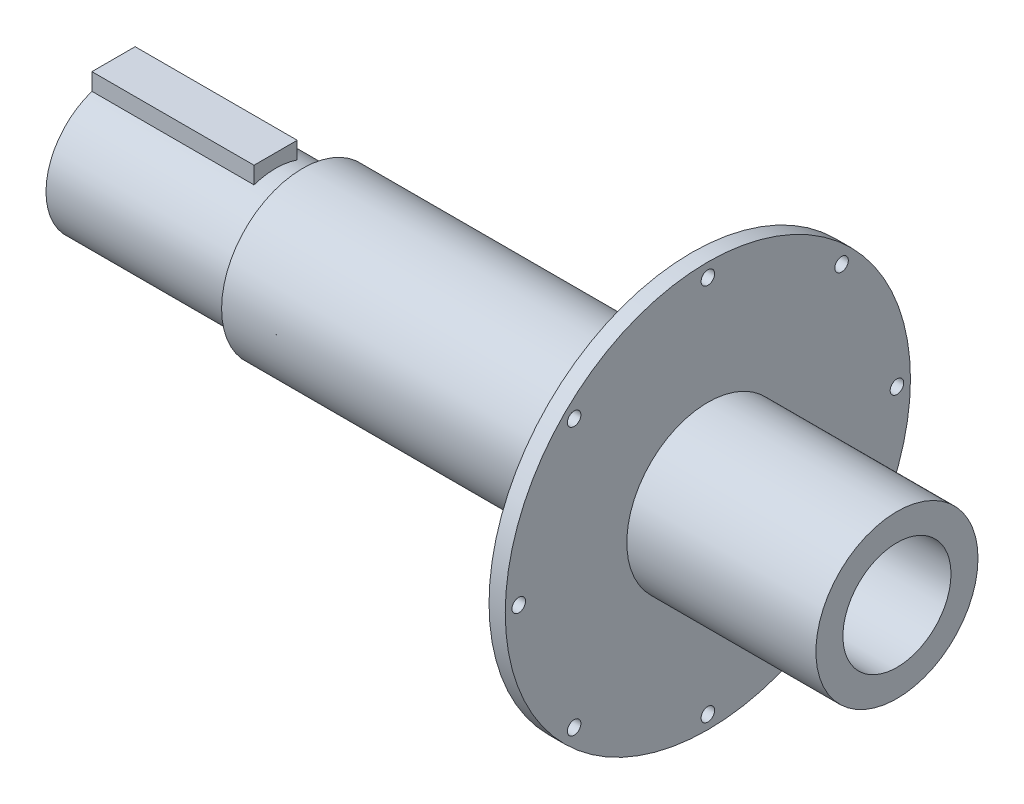
ISO-10303-21;
HEADER;
FILE_DESCRIPTION(('STEP AP214'),'2;1');
FILE_NAME('part.step','',(''),(''),'','','');
FILE_SCHEMA(('AUTOMOTIVE_DESIGN { 1 0 10303 214 1 1 1 1 }'));
ENDSEC;
DATA;
#1=APPLICATION_CONTEXT('core data for automotive mechanical design processes');
#2=APPLICATION_PROTOCOL_DEFINITION('international standard','automotive_design',2000,#1);
#3=PRODUCT_CONTEXT('',#1,'mechanical');
#4=PRODUCT('Part','Part','',(#3));
#5=PRODUCT_RELATED_PRODUCT_CATEGORY('part','',(#4));
#6=PRODUCT_DEFINITION_FORMATION('','',#4);
#7=PRODUCT_DEFINITION_CONTEXT('part definition',#1,'design');
#8=PRODUCT_DEFINITION('design','',#6,#7);
#9=PRODUCT_DEFINITION_SHAPE('','',#8);
#10=(LENGTH_UNIT() NAMED_UNIT(*) SI_UNIT(.MILLI.,.METRE.));
#11=(NAMED_UNIT(*) PLANE_ANGLE_UNIT() SI_UNIT($,.RADIAN.));
#12=(NAMED_UNIT(*) SI_UNIT($,.STERADIAN.) SOLID_ANGLE_UNIT());
#13=UNCERTAINTY_MEASURE_WITH_UNIT(LENGTH_MEASURE(1.E-05),#10,'distance_accuracy_value','');
#14=(GEOMETRIC_REPRESENTATION_CONTEXT(3) GLOBAL_UNCERTAINTY_ASSIGNED_CONTEXT((#13)) GLOBAL_UNIT_ASSIGNED_CONTEXT((#10,
#11,#12)) REPRESENTATION_CONTEXT('',''));
#15=CARTESIAN_POINT('',(0.,0.,0.));
#16=DIRECTION('',(0.,0.,1.));
#17=DIRECTION('',(1.,0.,0.));
#18=AXIS2_PLACEMENT_3D('',#15,#16,#17);
#19=CARTESIAN_POINT('',(-3.,0.,0.));
#20=DIRECTION('',(1.,0.,0.));
#21=DIRECTION('',(0.,0.,-1.));
#22=AXIS2_PLACEMENT_3D('',#19,#20,#21);
#23=CYLINDRICAL_SURFACE('',#22,10.);
#24=CARTESIAN_POINT('',(35.,0.,0.));
#25=DIRECTION('',(1.,0.,0.));
#26=DIRECTION('',(0.,0.,-1.));
#27=AXIS2_PLACEMENT_3D('',#24,#25,#26);
#28=CIRCLE('',#27,10.);
#29=CARTESIAN_POINT('',(35.,0.,-10.));
#30=VERTEX_POINT('',#29);
#31=EDGE_CURVE('E126',#30,#30,#28,.T.);
#32=ORIENTED_EDGE('',*,*,#31,.T.);
#33=EDGE_LOOP('',(#32));
#34=FACE_BOUND('',#33,.T.);
#35=CARTESIAN_POINT('',(-80.,0.,0.));
#36=DIRECTION('',(-1.,0.,0.));
#37=DIRECTION('',(0.,0.,1.));
#38=AXIS2_PLACEMENT_3D('',#35,#36,#37);
#39=CIRCLE('',#38,10.);
#40=CARTESIAN_POINT('',(-80.,0.,10.));
#41=VERTEX_POINT('',#40);
#42=EDGE_CURVE('E11',#41,#41,#39,.F.);
#43=ORIENTED_EDGE('',*,*,#42,.F.);
#44=EDGE_LOOP('',(#43));
#45=FACE_BOUND('',#44,.T.);
#46=ADVANCED_FACE('F45',(#34,#45),#23,.F.);
#47=CARTESIAN_POINT('',(-110.,0.,0.));
#48=DIRECTION('',(1.,0.,0.));
#49=DIRECTION('',(0.,0.,-1.));
#50=AXIS2_PLACEMENT_3D('',#47,#48,#49);
#51=CYLINDRICAL_SURFACE('',#50,15.);
#52=CARTESIAN_POINT('',(-3.,0.,0.));
#53=DIRECTION('',(1.,0.,0.));
#54=DIRECTION('',(0.,0.,-1.));
#55=AXIS2_PLACEMENT_3D('',#52,#53,#54);
#56=CIRCLE('',#55,15.);
#57=CARTESIAN_POINT('',(-3.,0.,-15.));
#58=VERTEX_POINT('',#57);
#59=EDGE_CURVE('E212',#58,#58,#56,.T.);
#60=ORIENTED_EDGE('',*,*,#59,.F.);
#61=EDGE_LOOP('',(#60));
#62=FACE_BOUND('',#61,.T.);
#63=CARTESIAN_POINT('',(-75.,0.,0.));
#64=DIRECTION('',(-1.,0.,0.));
#65=DIRECTION('',(0.,0.,1.));
#66=AXIS2_PLACEMENT_3D('',#63,#64,#65);
#67=CIRCLE('',#66,15.);
#68=CARTESIAN_POINT('',(-75.,0.,15.));
#69=VERTEX_POINT('',#68);
#70=EDGE_CURVE('E162',#69,#69,#67,.F.);
#71=ORIENTED_EDGE('',*,*,#70,.T.);
#72=EDGE_LOOP('',(#71));
#73=FACE_BOUND('',#72,.T.);
#74=ADVANCED_FACE('F238',(#62,#73),#51,.T.);
#75=CARTESIAN_POINT('',(-110.,0.,0.));
#76=DIRECTION('',(1.,0.,0.));
#77=DIRECTION('',(0.,0.,-1.));
#78=AXIS2_PLACEMENT_3D('',#75,#76,#77);
#79=PLANE('',#78);
#80=CARTESIAN_POINT('',(-110.,0.,0.));
#81=DIRECTION('',(-1.,0.,0.));
#82=DIRECTION('',(0.,0.,1.));
#83=AXIS2_PLACEMENT_3D('',#80,#81,#82);
#84=CIRCLE('',#83,12.5);
#85=CARTESIAN_POINT('',(-110.,11.842719282327,-4.));
#86=VERTEX_POINT('',#85);
#87=CARTESIAN_POINT('',(-110.,11.842719282327,4.));
#88=VERTEX_POINT('',#87);
#89=EDGE_CURVE('E171',#86,#88,#84,.T.);
#90=ORIENTED_EDGE('',*,*,#89,.T.);
#91=DIRECTION('',(0.,-1.,0.));
#92=VECTOR('',#91,1.);
#93=CARTESIAN_POINT('',(-110.,0.,4.));
#94=LINE('',#93,#92);
#95=CARTESIAN_POINT('',(-110.,15.,4.));
#96=VERTEX_POINT('',#95);
#97=EDGE_CURVE('E103',#96,#88,#94,.T.);
#98=ORIENTED_EDGE('',*,*,#97,.F.);
#99=DIRECTION('',(0.,0.,1.));
#100=VECTOR('',#99,1.);
#101=CARTESIAN_POINT('',(-110.,15.,0.));
#102=LINE('',#101,#100);
#103=CARTESIAN_POINT('',(-110.,15.,-4.));
#104=VERTEX_POINT('',#103);
#105=EDGE_CURVE('E490',#104,#96,#102,.T.);
#106=ORIENTED_EDGE('',*,*,#105,.F.);
#107=DIRECTION('',(0.,-1.,0.));
#108=VECTOR('',#107,1.);
#109=CARTESIAN_POINT('',(-110.,0.,-4.));
#110=LINE('',#109,#108);
#111=EDGE_CURVE('E60',#104,#86,#110,.T.);
#112=ORIENTED_EDGE('',*,*,#111,.T.);
#113=EDGE_LOOP('',(#90,#98,#106,#112));
#114=FACE_BOUND('',#113,.T.);
#115=ADVANCED_FACE('F245',(#114),#79,.F.);
#116=CARTESIAN_POINT('',(-3.,0.,0.));
#117=DIRECTION('',(1.,0.,0.));
#118=DIRECTION('',(0.,0.,-1.));
#119=AXIS2_PLACEMENT_3D('',#116,#117,#118);
#120=PLANE('',#119);
#121=CARTESIAN_POINT('',(-3.,0.,35.));
#122=DIRECTION('',(-1.,0.,0.));
#123=DIRECTION('',(0.,0.,1.));
#124=AXIS2_PLACEMENT_3D('',#121,#122,#123);
#125=CIRCLE('',#124,1.525);
#126=CARTESIAN_POINT('',(-3.,0.,36.525));
#127=VERTEX_POINT('',#126);
#128=EDGE_CURVE('E164',#127,#127,#125,.T.);
#129=ORIENTED_EDGE('',*,*,#128,.F.);
#130=EDGE_LOOP('',(#129));
#131=FACE_BOUND('',#130,.T.);
#132=CARTESIAN_POINT('',(-3.,35.,0.));
#133=DIRECTION('',(-1.,0.,0.));
#134=DIRECTION('',(0.,0.,1.));
#135=AXIS2_PLACEMENT_3D('',#132,#133,#134);
#136=CIRCLE('',#135,1.525);
#137=CARTESIAN_POINT('',(-3.,35.,1.525));
#138=VERTEX_POINT('',#137);
#139=EDGE_CURVE('E160',#138,#138,#136,.T.);
#140=ORIENTED_EDGE('',*,*,#139,.F.);
#141=EDGE_LOOP('',(#140));
#142=FACE_BOUND('',#141,.T.);
#143=CARTESIAN_POINT('',(-3.,0.,-35.));
#144=DIRECTION('',(-1.,0.,0.));
#145=DIRECTION('',(0.,0.,1.));
#146=AXIS2_PLACEMENT_3D('',#143,#144,#145);
#147=CIRCLE('',#146,1.525);
#148=CARTESIAN_POINT('',(-3.,0.,-33.475));
#149=VERTEX_POINT('',#148);
#150=EDGE_CURVE('E156',#149,#149,#147,.T.);
#151=ORIENTED_EDGE('',*,*,#150,.F.);
#152=EDGE_LOOP('',(#151));
#153=FACE_BOUND('',#152,.T.);
#154=CARTESIAN_POINT('',(-3.,-35.,0.));
#155=DIRECTION('',(-1.,0.,0.));
#156=DIRECTION('',(0.,0.,1.));
#157=AXIS2_PLACEMENT_3D('',#154,#155,#156);
#158=CIRCLE('',#157,1.525);
#159=CARTESIAN_POINT('',(-3.,-35.,1.525));
#160=VERTEX_POINT('',#159);
#161=EDGE_CURVE('E151',#160,#160,#158,.T.);
#162=ORIENTED_EDGE('',*,*,#161,.F.);
#163=EDGE_LOOP('',(#162));
#164=FACE_BOUND('',#163,.T.);
#165=CARTESIAN_POINT('',(-3.,24.7487373415294,24.748737341529));
#166=DIRECTION('',(-1.,0.,0.));
#167=DIRECTION('',(0.,0.,1.));
#168=AXIS2_PLACEMENT_3D('',#165,#166,#167);
#169=CIRCLE('',#168,1.525);
#170=CARTESIAN_POINT('',(-3.,24.7487373415294,26.273737341529));
#171=VERTEX_POINT('',#170);
#172=EDGE_CURVE('E146',#171,#171,#169,.T.);
#173=ORIENTED_EDGE('',*,*,#172,.F.);
#174=EDGE_LOOP('',(#173));
#175=FACE_BOUND('',#174,.T.);
#176=CARTESIAN_POINT('',(-3.,24.7487373415289,-24.7487373415294));
#177=DIRECTION('',(-1.,0.,0.));
#178=DIRECTION('',(0.,0.,1.));
#179=AXIS2_PLACEMENT_3D('',#176,#177,#178);
#180=CIRCLE('',#179,1.525);
#181=CARTESIAN_POINT('',(-3.,24.7487373415289,-23.2237373415294));
#182=VERTEX_POINT('',#181);
#183=EDGE_CURVE('E141',#182,#182,#180,.T.);
#184=ORIENTED_EDGE('',*,*,#183,.F.);
#185=EDGE_LOOP('',(#184));
#186=FACE_BOUND('',#185,.T.);
#187=CARTESIAN_POINT('',(-3.,-24.7487373415294,-24.748737341529));
#188=DIRECTION('',(-1.,0.,0.));
#189=DIRECTION('',(0.,0.,1.));
#190=AXIS2_PLACEMENT_3D('',#187,#188,#189);
#191=CIRCLE('',#190,1.525);
#192=CARTESIAN_POINT('',(-3.,-24.7487373415294,-23.223737341529));
#193=VERTEX_POINT('',#192);
#194=EDGE_CURVE('E136',#193,#193,#191,.T.);
#195=ORIENTED_EDGE('',*,*,#194,.F.);
#196=EDGE_LOOP('',(#195));
#197=FACE_BOUND('',#196,.T.);
#198=CARTESIAN_POINT('',(-3.,-24.748737341529,24.7487373415294));
#199=DIRECTION('',(-1.,0.,0.));
#200=DIRECTION('',(0.,0.,1.));
#201=AXIS2_PLACEMENT_3D('',#198,#199,#200);
#202=CIRCLE('',#201,1.525);
#203=CARTESIAN_POINT('',(-3.,-24.748737341529,26.2737373415294));
#204=VERTEX_POINT('',#203);
#205=EDGE_CURVE('E131',#204,#204,#202,.T.);
#206=ORIENTED_EDGE('',*,*,#205,.F.);
#207=EDGE_LOOP('',(#206));
#208=FACE_BOUND('',#207,.T.);
#209=ORIENTED_EDGE('',*,*,#59,.T.);
#210=EDGE_LOOP('',(#209));
#211=FACE_BOUND('',#210,.T.);
#212=CARTESIAN_POINT('',(-3.,0.,0.));
#213=DIRECTION('',(1.,0.,0.));
#214=DIRECTION('',(0.,0.,-1.));
#215=AXIS2_PLACEMENT_3D('',#212,#213,#214);
#216=CIRCLE('',#215,37.5);
#217=CARTESIAN_POINT('',(-3.,0.,-37.5));
#218=VERTEX_POINT('',#217);
#219=EDGE_CURVE('E114',#218,#218,#216,.T.);
#220=ORIENTED_EDGE('',*,*,#219,.F.);
#221=EDGE_LOOP('',(#220));
#222=FACE_BOUND('',#221,.T.);
#223=ADVANCED_FACE('F233',(#131,#142,#153,#164,#175,#186,#197,#208,#211,#222),#120,.F.);
#224=CARTESIAN_POINT('',(0.,0.,0.));
#225=DIRECTION('',(1.,0.,0.));
#226=DIRECTION('',(0.,0.,-1.));
#227=AXIS2_PLACEMENT_3D('',#224,#225,#226);
#228=PLANE('',#227);
#229=CARTESIAN_POINT('',(0.,0.,35.));
#230=DIRECTION('',(1.,0.,0.));
#231=DIRECTION('',(0.,0.,-1.));
#232=AXIS2_PLACEMENT_3D('',#229,#230,#231);
#233=CIRCLE('',#232,1.25);
#234=CARTESIAN_POINT('',(0.,0.,33.75));
#235=VERTEX_POINT('',#234);
#236=EDGE_CURVE('E158',#235,#235,#233,.T.);
#237=ORIENTED_EDGE('',*,*,#236,.F.);
#238=EDGE_LOOP('',(#237));
#239=FACE_BOUND('',#238,.T.);
#240=CARTESIAN_POINT('',(0.,35.,0.));
#241=DIRECTION('',(1.,0.,0.));
#242=DIRECTION('',(0.,0.,-1.));
#243=AXIS2_PLACEMENT_3D('',#240,#241,#242);
#244=CIRCLE('',#243,1.25);
#245=CARTESIAN_POINT('',(0.,35.,-1.25));
#246=VERTEX_POINT('',#245);
#247=EDGE_CURVE('E153',#246,#246,#244,.T.);
#248=ORIENTED_EDGE('',*,*,#247,.F.);
#249=EDGE_LOOP('',(#248));
#250=FACE_BOUND('',#249,.T.);
#251=CARTESIAN_POINT('',(0.,0.,-35.));
#252=DIRECTION('',(1.,0.,0.));
#253=DIRECTION('',(0.,0.,-1.));
#254=AXIS2_PLACEMENT_3D('',#251,#252,#253);
#255=CIRCLE('',#254,1.25);
#256=CARTESIAN_POINT('',(0.,0.,-36.25));
#257=VERTEX_POINT('',#256);
#258=EDGE_CURVE('E148',#257,#257,#255,.T.);
#259=ORIENTED_EDGE('',*,*,#258,.F.);
#260=EDGE_LOOP('',(#259));
#261=FACE_BOUND('',#260,.T.);
#262=CARTESIAN_POINT('',(0.,-35.,0.));
#263=DIRECTION('',(1.,0.,0.));
#264=DIRECTION('',(0.,0.,-1.));
#265=AXIS2_PLACEMENT_3D('',#262,#263,#264);
#266=CIRCLE('',#265,1.25);
#267=CARTESIAN_POINT('',(0.,-35.,-1.25));
#268=VERTEX_POINT('',#267);
#269=EDGE_CURVE('E143',#268,#268,#266,.T.);
#270=ORIENTED_EDGE('',*,*,#269,.F.);
#271=EDGE_LOOP('',(#270));
#272=FACE_BOUND('',#271,.T.);
#273=CARTESIAN_POINT('',(0.,24.7487373415294,24.748737341529));
#274=DIRECTION('',(1.,0.,0.));
#275=DIRECTION('',(0.,0.,-1.));
#276=AXIS2_PLACEMENT_3D('',#273,#274,#275);
#277=CIRCLE('',#276,1.24999999999999);
#278=CARTESIAN_POINT('',(0.,24.7487373415294,23.498737341529));
#279=VERTEX_POINT('',#278);
#280=EDGE_CURVE('E138',#279,#279,#277,.T.);
#281=ORIENTED_EDGE('',*,*,#280,.F.);
#282=EDGE_LOOP('',(#281));
#283=FACE_BOUND('',#282,.T.);
#284=CARTESIAN_POINT('',(0.,24.7487373415289,-24.7487373415294));
#285=DIRECTION('',(1.,0.,0.));
#286=DIRECTION('',(0.,0.,-1.));
#287=AXIS2_PLACEMENT_3D('',#284,#285,#286);
#288=CIRCLE('',#287,1.24999999999999);
#289=CARTESIAN_POINT('',(0.,24.7487373415289,-25.9987373415294));
#290=VERTEX_POINT('',#289);
#291=EDGE_CURVE('E133',#290,#290,#288,.T.);
#292=ORIENTED_EDGE('',*,*,#291,.F.);
#293=EDGE_LOOP('',(#292));
#294=FACE_BOUND('',#293,.T.);
#295=CARTESIAN_POINT('',(0.,-24.7487373415294,-24.748737341529));
#296=DIRECTION('',(1.,0.,0.));
#297=DIRECTION('',(0.,0.,-1.));
#298=AXIS2_PLACEMENT_3D('',#295,#296,#297);
#299=CIRCLE('',#298,1.24999999999999);
#300=CARTESIAN_POINT('',(0.,-24.7487373415294,-25.998737341529));
#301=VERTEX_POINT('',#300);
#302=EDGE_CURVE('E128',#301,#301,#299,.T.);
#303=ORIENTED_EDGE('',*,*,#302,.F.);
#304=EDGE_LOOP('',(#303));
#305=FACE_BOUND('',#304,.T.);
#306=CARTESIAN_POINT('',(0.,-24.748737341529,24.7487373415294));
#307=DIRECTION('',(1.,0.,0.));
#308=DIRECTION('',(0.,0.,-1.));
#309=AXIS2_PLACEMENT_3D('',#306,#307,#308);
#310=CIRCLE('',#309,1.24999999999999);
#311=CARTESIAN_POINT('',(0.,-24.748737341529,23.4987373415294));
#312=VERTEX_POINT('',#311);
#313=EDGE_CURVE('E123',#312,#312,#310,.T.);
#314=ORIENTED_EDGE('',*,*,#313,.F.);
#315=EDGE_LOOP('',(#314));
#316=FACE_BOUND('',#315,.T.);
#317=CARTESIAN_POINT('',(0.,0.,0.));
#318=DIRECTION('',(1.,0.,0.));
#319=DIRECTION('',(0.,0.,-1.));
#320=AXIS2_PLACEMENT_3D('',#317,#318,#319);
#321=CIRCLE('',#320,15.);
#322=CARTESIAN_POINT('',(0.,0.,-15.));
#323=VERTEX_POINT('',#322);
#324=EDGE_CURVE('E112',#323,#323,#321,.T.);
#325=ORIENTED_EDGE('',*,*,#324,.F.);
#326=EDGE_LOOP('',(#325));
#327=FACE_BOUND('',#326,.T.);
#328=CARTESIAN_POINT('',(0.,0.,0.));
#329=DIRECTION('',(1.,0.,0.));
#330=DIRECTION('',(0.,0.,-1.));
#331=AXIS2_PLACEMENT_3D('',#328,#329,#330);
#332=CIRCLE('',#331,37.5);
#333=CARTESIAN_POINT('',(0.,0.,-37.5));
#334=VERTEX_POINT('',#333);
#335=EDGE_CURVE('E119',#334,#334,#332,.T.);
#336=ORIENTED_EDGE('',*,*,#335,.T.);
#337=EDGE_LOOP('',(#336));
#338=FACE_BOUND('',#337,.T.);
#339=ADVANCED_FACE('F219',(#239,#250,#261,#272,#283,#294,#305,#316,#327,#338),#228,.T.);
#340=CARTESIAN_POINT('',(-3.,0.,0.));
#341=DIRECTION('',(1.,0.,0.));
#342=DIRECTION('',(0.,0.,-1.));
#343=AXIS2_PLACEMENT_3D('',#340,#341,#342);
#344=CYLINDRICAL_SURFACE('',#343,37.5);
#345=ORIENTED_EDGE('',*,*,#219,.T.);
#346=EDGE_LOOP('',(#345));
#347=FACE_BOUND('',#346,.T.);
#348=ORIENTED_EDGE('',*,*,#335,.F.);
#349=EDGE_LOOP('',(#348));
#350=FACE_BOUND('',#349,.T.);
#351=ADVANCED_FACE('F221',(#347,#350),#344,.T.);
#352=CARTESIAN_POINT('',(35.,0.,0.));
#353=DIRECTION('',(1.,0.,0.));
#354=DIRECTION('',(0.,0.,-1.));
#355=AXIS2_PLACEMENT_3D('',#352,#353,#354);
#356=PLANE('',#355);
#357=ORIENTED_EDGE('',*,*,#31,.F.);
#358=EDGE_LOOP('',(#357));
#359=FACE_BOUND('',#358,.T.);
#360=CARTESIAN_POINT('',(35.,0.,0.));
#361=DIRECTION('',(1.,0.,0.));
#362=DIRECTION('',(0.,0.,-1.));
#363=AXIS2_PLACEMENT_3D('',#360,#361,#362);
#364=CIRCLE('',#363,15.);
#365=CARTESIAN_POINT('',(35.,0.,-15.));
#366=VERTEX_POINT('',#365);
#367=EDGE_CURVE('E209',#366,#366,#364,.T.);
#368=ORIENTED_EDGE('',*,*,#367,.T.);
#369=EDGE_LOOP('',(#368));
#370=FACE_BOUND('',#369,.T.);
#371=ADVANCED_FACE('F223',(#359,#370),#356,.T.);
#372=ORIENTED_EDGE('',*,*,#324,.T.);
#373=EDGE_LOOP('',(#372));
#374=FACE_BOUND('',#373,.T.);
#375=ORIENTED_EDGE('',*,*,#367,.F.);
#376=EDGE_LOOP('',(#375));
#377=FACE_BOUND('',#376,.T.);
#378=ADVANCED_FACE('F230',(#374,#377),#51,.T.);
#379=CARTESIAN_POINT('',(-3.,-24.748737341529,24.7487373415294));
#380=DIRECTION('',(-1.,0.,0.));
#381=DIRECTION('',(0.,0.,1.));
#382=AXIS2_PLACEMENT_3D('',#379,#380,#381);
#383=CYLINDRICAL_SURFACE('',#382,1.24999999999999);
#384=ORIENTED_EDGE('',*,*,#313,.T.);
#385=EDGE_LOOP('',(#384));
#386=FACE_BOUND('',#385,.T.);
#387=CARTESIAN_POINT('',(-2.725,-24.748737341529,24.7487373415294));
#388=DIRECTION('',(-1.,0.,0.));
#389=DIRECTION('',(0.,0.,1.));
#390=AXIS2_PLACEMENT_3D('',#387,#388,#389);
#391=CIRCLE('',#390,1.25);
#392=CARTESIAN_POINT('',(-2.725,-24.748737341529,25.9987373415294));
#393=VERTEX_POINT('',#392);
#394=EDGE_CURVE('E127',#393,#393,#391,.T.);
#395=ORIENTED_EDGE('',*,*,#394,.T.);
#396=EDGE_LOOP('',(#395));
#397=FACE_BOUND('',#396,.T.);
#398=ADVANCED_FACE('F334',(#386,#397),#383,.F.);
#399=CARTESIAN_POINT('',(-3.,-24.748737341529,24.7487373415294));
#400=DIRECTION('',(-1.,0.,0.));
#401=DIRECTION('',(0.,0.,1.));
#402=AXIS2_PLACEMENT_3D('',#399,#400,#401);
#403=CONICAL_SURFACE('',#402,1.525,0.785398163397445);
#404=ORIENTED_EDGE('',*,*,#394,.F.);
#405=EDGE_LOOP('',(#404));
#406=FACE_BOUND('',#405,.T.);
#407=ORIENTED_EDGE('',*,*,#205,.T.);
#408=EDGE_LOOP('',(#407));
#409=FACE_BOUND('',#408,.T.);
#410=ADVANCED_FACE('F330',(#406,#409),#403,.F.);
#411=CARTESIAN_POINT('',(-3.,-24.7487373415294,-24.748737341529));
#412=DIRECTION('',(-1.,0.,0.));
#413=DIRECTION('',(0.,0.,1.));
#414=AXIS2_PLACEMENT_3D('',#411,#412,#413);
#415=CYLINDRICAL_SURFACE('',#414,1.24999999999999);
#416=ORIENTED_EDGE('',*,*,#302,.T.);
#417=EDGE_LOOP('',(#416));
#418=FACE_BOUND('',#417,.T.);
#419=CARTESIAN_POINT('',(-2.725,-24.7487373415294,-24.748737341529));
#420=DIRECTION('',(-1.,0.,0.));
#421=DIRECTION('',(0.,0.,1.));
#422=AXIS2_PLACEMENT_3D('',#419,#420,#421);
#423=CIRCLE('',#422,1.25);
#424=CARTESIAN_POINT('',(-2.725,-24.7487373415294,-23.498737341529));
#425=VERTEX_POINT('',#424);
#426=EDGE_CURVE('E132',#425,#425,#423,.T.);
#427=ORIENTED_EDGE('',*,*,#426,.T.);
#428=EDGE_LOOP('',(#427));
#429=FACE_BOUND('',#428,.T.);
#430=ADVANCED_FACE('F326',(#418,#429),#415,.F.);
#431=CARTESIAN_POINT('',(-3.,-24.7487373415294,-24.748737341529));
#432=DIRECTION('',(-1.,0.,0.));
#433=DIRECTION('',(0.,0.,1.));
#434=AXIS2_PLACEMENT_3D('',#431,#432,#433);
#435=CONICAL_SURFACE('',#434,1.525,0.785398163397445);
#436=ORIENTED_EDGE('',*,*,#426,.F.);
#437=EDGE_LOOP('',(#436));
#438=FACE_BOUND('',#437,.T.);
#439=ORIENTED_EDGE('',*,*,#194,.T.);
#440=EDGE_LOOP('',(#439));
#441=FACE_BOUND('',#440,.T.);
#442=ADVANCED_FACE('F322',(#438,#441),#435,.F.);
#443=CARTESIAN_POINT('',(-3.,24.7487373415289,-24.7487373415294));
#444=DIRECTION('',(-1.,0.,0.));
#445=DIRECTION('',(0.,0.,1.));
#446=AXIS2_PLACEMENT_3D('',#443,#444,#445);
#447=CYLINDRICAL_SURFACE('',#446,1.24999999999999);
#448=ORIENTED_EDGE('',*,*,#291,.T.);
#449=EDGE_LOOP('',(#448));
#450=FACE_BOUND('',#449,.T.);
#451=CARTESIAN_POINT('',(-2.725,24.7487373415289,-24.7487373415294));
#452=DIRECTION('',(-1.,0.,0.));
#453=DIRECTION('',(0.,0.,1.));
#454=AXIS2_PLACEMENT_3D('',#451,#452,#453);
#455=CIRCLE('',#454,1.25);
#456=CARTESIAN_POINT('',(-2.725,24.7487373415289,-23.4987373415294));
#457=VERTEX_POINT('',#456);
#458=EDGE_CURVE('E137',#457,#457,#455,.T.);
#459=ORIENTED_EDGE('',*,*,#458,.T.);
#460=EDGE_LOOP('',(#459));
#461=FACE_BOUND('',#460,.T.);
#462=ADVANCED_FACE('F318',(#450,#461),#447,.F.);
#463=CARTESIAN_POINT('',(-3.,24.7487373415289,-24.7487373415294));
#464=DIRECTION('',(-1.,0.,0.));
#465=DIRECTION('',(0.,0.,1.));
#466=AXIS2_PLACEMENT_3D('',#463,#464,#465);
#467=CONICAL_SURFACE('',#466,1.525,0.785398163397445);
#468=ORIENTED_EDGE('',*,*,#458,.F.);
#469=EDGE_LOOP('',(#468));
#470=FACE_BOUND('',#469,.T.);
#471=ORIENTED_EDGE('',*,*,#183,.T.);
#472=EDGE_LOOP('',(#471));
#473=FACE_BOUND('',#472,.T.);
#474=ADVANCED_FACE('F314',(#470,#473),#467,.F.);
#475=CARTESIAN_POINT('',(-3.,24.7487373415294,24.748737341529));
#476=DIRECTION('',(-1.,0.,0.));
#477=DIRECTION('',(0.,0.,1.));
#478=AXIS2_PLACEMENT_3D('',#475,#476,#477);
#479=CYLINDRICAL_SURFACE('',#478,1.24999999999999);
#480=ORIENTED_EDGE('',*,*,#280,.T.);
#481=EDGE_LOOP('',(#480));
#482=FACE_BOUND('',#481,.T.);
#483=CARTESIAN_POINT('',(-2.725,24.7487373415294,24.748737341529));
#484=DIRECTION('',(-1.,0.,0.));
#485=DIRECTION('',(0.,0.,1.));
#486=AXIS2_PLACEMENT_3D('',#483,#484,#485);
#487=CIRCLE('',#486,1.25);
#488=CARTESIAN_POINT('',(-2.725,24.7487373415294,25.998737341529));
#489=VERTEX_POINT('',#488);
#490=EDGE_CURVE('E142',#489,#489,#487,.T.);
#491=ORIENTED_EDGE('',*,*,#490,.T.);
#492=EDGE_LOOP('',(#491));
#493=FACE_BOUND('',#492,.T.);
#494=ADVANCED_FACE('F310',(#482,#493),#479,.F.);
#495=CARTESIAN_POINT('',(-3.,24.7487373415294,24.748737341529));
#496=DIRECTION('',(-1.,0.,0.));
#497=DIRECTION('',(0.,0.,1.));
#498=AXIS2_PLACEMENT_3D('',#495,#496,#497);
#499=CONICAL_SURFACE('',#498,1.525,0.785398163397445);
#500=ORIENTED_EDGE('',*,*,#490,.F.);
#501=EDGE_LOOP('',(#500));
#502=FACE_BOUND('',#501,.T.);
#503=ORIENTED_EDGE('',*,*,#172,.T.);
#504=EDGE_LOOP('',(#503));
#505=FACE_BOUND('',#504,.T.);
#506=ADVANCED_FACE('F306',(#502,#505),#499,.F.);
#507=CARTESIAN_POINT('',(-3.,-35.,0.));
#508=DIRECTION('',(-1.,0.,0.));
#509=DIRECTION('',(0.,0.,1.));
#510=AXIS2_PLACEMENT_3D('',#507,#508,#509);
#511=CYLINDRICAL_SURFACE('',#510,1.25);
#512=ORIENTED_EDGE('',*,*,#269,.T.);
#513=EDGE_LOOP('',(#512));
#514=FACE_BOUND('',#513,.T.);
#515=CARTESIAN_POINT('',(-2.725,-35.,0.));
#516=DIRECTION('',(-1.,0.,0.));
#517=DIRECTION('',(0.,0.,1.));
#518=AXIS2_PLACEMENT_3D('',#515,#516,#517);
#519=CIRCLE('',#518,1.25);
#520=CARTESIAN_POINT('',(-2.725,-35.,1.25));
#521=VERTEX_POINT('',#520);
#522=EDGE_CURVE('E147',#521,#521,#519,.T.);
#523=ORIENTED_EDGE('',*,*,#522,.T.);
#524=EDGE_LOOP('',(#523));
#525=FACE_BOUND('',#524,.T.);
#526=ADVANCED_FACE('F302',(#514,#525),#511,.F.);
#527=CARTESIAN_POINT('',(-3.,-35.,0.));
#528=DIRECTION('',(-1.,0.,0.));
#529=DIRECTION('',(0.,0.,1.));
#530=AXIS2_PLACEMENT_3D('',#527,#528,#529);
#531=CONICAL_SURFACE('',#530,1.525,0.785398163397439);
#532=ORIENTED_EDGE('',*,*,#522,.F.);
#533=EDGE_LOOP('',(#532));
#534=FACE_BOUND('',#533,.T.);
#535=ORIENTED_EDGE('',*,*,#161,.T.);
#536=EDGE_LOOP('',(#535));
#537=FACE_BOUND('',#536,.T.);
#538=ADVANCED_FACE('F298',(#534,#537),#531,.F.);
#539=CARTESIAN_POINT('',(-3.,0.,-35.));
#540=DIRECTION('',(-1.,0.,0.));
#541=DIRECTION('',(0.,0.,1.));
#542=AXIS2_PLACEMENT_3D('',#539,#540,#541);
#543=CYLINDRICAL_SURFACE('',#542,1.25);
#544=ORIENTED_EDGE('',*,*,#258,.T.);
#545=EDGE_LOOP('',(#544));
#546=FACE_BOUND('',#545,.T.);
#547=CARTESIAN_POINT('',(-2.725,0.,-35.));
#548=DIRECTION('',(-1.,0.,0.));
#549=DIRECTION('',(0.,0.,1.));
#550=AXIS2_PLACEMENT_3D('',#547,#548,#549);
#551=CIRCLE('',#550,1.25);
#552=CARTESIAN_POINT('',(-2.725,0.,-33.75));
#553=VERTEX_POINT('',#552);
#554=EDGE_CURVE('E152',#553,#553,#551,.T.);
#555=ORIENTED_EDGE('',*,*,#554,.T.);
#556=EDGE_LOOP('',(#555));
#557=FACE_BOUND('',#556,.T.);
#558=ADVANCED_FACE('F294',(#546,#557),#543,.F.);
#559=CARTESIAN_POINT('',(-3.,0.,-35.));
#560=DIRECTION('',(-1.,0.,0.));
#561=DIRECTION('',(0.,0.,1.));
#562=AXIS2_PLACEMENT_3D('',#559,#560,#561);
#563=CONICAL_SURFACE('',#562,1.525,0.785398163397446);
#564=ORIENTED_EDGE('',*,*,#554,.F.);
#565=EDGE_LOOP('',(#564));
#566=FACE_BOUND('',#565,.T.);
#567=ORIENTED_EDGE('',*,*,#150,.T.);
#568=EDGE_LOOP('',(#567));
#569=FACE_BOUND('',#568,.T.);
#570=ADVANCED_FACE('F290',(#566,#569),#563,.F.);
#571=CARTESIAN_POINT('',(-3.,35.,0.));
#572=DIRECTION('',(-1.,0.,0.));
#573=DIRECTION('',(0.,0.,1.));
#574=AXIS2_PLACEMENT_3D('',#571,#572,#573);
#575=CYLINDRICAL_SURFACE('',#574,1.25);
#576=ORIENTED_EDGE('',*,*,#247,.T.);
#577=EDGE_LOOP('',(#576));
#578=FACE_BOUND('',#577,.T.);
#579=CARTESIAN_POINT('',(-2.725,35.,0.));
#580=DIRECTION('',(-1.,0.,0.));
#581=DIRECTION('',(0.,0.,1.));
#582=AXIS2_PLACEMENT_3D('',#579,#580,#581);
#583=CIRCLE('',#582,1.25);
#584=CARTESIAN_POINT('',(-2.725,35.,1.25));
#585=VERTEX_POINT('',#584);
#586=EDGE_CURVE('E157',#585,#585,#583,.T.);
#587=ORIENTED_EDGE('',*,*,#586,.T.);
#588=EDGE_LOOP('',(#587));
#589=FACE_BOUND('',#588,.T.);
#590=ADVANCED_FACE('F286',(#578,#589),#575,.F.);
#591=CARTESIAN_POINT('',(-3.,35.,0.));
#592=DIRECTION('',(-1.,0.,0.));
#593=DIRECTION('',(0.,0.,1.));
#594=AXIS2_PLACEMENT_3D('',#591,#592,#593);
#595=CONICAL_SURFACE('',#594,1.525,0.785398163397439);
#596=ORIENTED_EDGE('',*,*,#586,.F.);
#597=EDGE_LOOP('',(#596));
#598=FACE_BOUND('',#597,.T.);
#599=ORIENTED_EDGE('',*,*,#139,.T.);
#600=EDGE_LOOP('',(#599));
#601=FACE_BOUND('',#600,.T.);
#602=ADVANCED_FACE('F282',(#598,#601),#595,.F.);
#603=CARTESIAN_POINT('',(-3.,0.,35.));
#604=DIRECTION('',(-1.,0.,0.));
#605=DIRECTION('',(0.,0.,1.));
#606=AXIS2_PLACEMENT_3D('',#603,#604,#605);
#607=CYLINDRICAL_SURFACE('',#606,1.25);
#608=ORIENTED_EDGE('',*,*,#236,.T.);
#609=EDGE_LOOP('',(#608));
#610=FACE_BOUND('',#609,.T.);
#611=CARTESIAN_POINT('',(-2.725,0.,35.));
#612=DIRECTION('',(-1.,0.,0.));
#613=DIRECTION('',(0.,0.,1.));
#614=AXIS2_PLACEMENT_3D('',#611,#612,#613);
#615=CIRCLE('',#614,1.25);
#616=CARTESIAN_POINT('',(-2.725,0.,36.25));
#617=VERTEX_POINT('',#616);
#618=EDGE_CURVE('E161',#617,#617,#615,.T.);
#619=ORIENTED_EDGE('',*,*,#618,.T.);
#620=EDGE_LOOP('',(#619));
#621=FACE_BOUND('',#620,.T.);
#622=ADVANCED_FACE('F278',(#610,#621),#607,.F.);
#623=CARTESIAN_POINT('',(-3.,0.,35.));
#624=DIRECTION('',(-1.,0.,0.));
#625=DIRECTION('',(0.,0.,1.));
#626=AXIS2_PLACEMENT_3D('',#623,#624,#625);
#627=CONICAL_SURFACE('',#626,1.525,0.785398163397446);
#628=ORIENTED_EDGE('',*,*,#618,.F.);
#629=EDGE_LOOP('',(#628));
#630=FACE_BOUND('',#629,.T.);
#631=ORIENTED_EDGE('',*,*,#128,.T.);
#632=EDGE_LOOP('',(#631));
#633=FACE_BOUND('',#632,.T.);
#634=ADVANCED_FACE('F272',(#630,#633),#627,.F.);
#635=CARTESIAN_POINT('',(-75.,0.,0.));
#636=DIRECTION('',(-1.,0.,0.));
#637=DIRECTION('',(0.,0.,1.));
#638=AXIS2_PLACEMENT_3D('',#635,#636,#637);
#639=CYLINDRICAL_SURFACE('',#638,12.5);
#640=DIRECTION('',(-1.,0.,0.));
#641=VECTOR('',#640,1.);
#642=CARTESIAN_POINT('',(-80.,11.842719282327,-4.));
#643=LINE('',#642,#641);
#644=CARTESIAN_POINT('',(-80.,11.842719282327,-4.));
#645=VERTEX_POINT('',#644);
#646=EDGE_CURVE('E107',#645,#86,#643,.T.);
#647=ORIENTED_EDGE('',*,*,#646,.F.);
#648=CARTESIAN_POINT('',(-80.,0.,0.));
#649=DIRECTION('',(-1.,0.,0.));
#650=DIRECTION('',(0.,0.,1.));
#651=AXIS2_PLACEMENT_3D('',#648,#649,#650);
#652=CIRCLE('',#651,12.5);
#653=CARTESIAN_POINT('',(-80.,11.842719282327,4.));
#654=VERTEX_POINT('',#653);
#655=EDGE_CURVE('E48',#645,#654,#652,.F.);
#656=ORIENTED_EDGE('',*,*,#655,.T.);
#657=DIRECTION('',(-1.,0.,0.));
#658=VECTOR('',#657,1.);
#659=CARTESIAN_POINT('',(-80.,11.842719282327,4.));
#660=LINE('',#659,#658);
#661=EDGE_CURVE('E100',#654,#88,#660,.T.);
#662=ORIENTED_EDGE('',*,*,#661,.T.);
#663=ORIENTED_EDGE('',*,*,#89,.F.);
#664=EDGE_LOOP('',(#647,#656,#662,#663));
#665=FACE_BOUND('',#664,.T.);
#666=CARTESIAN_POINT('',(-75.,0.,0.));
#667=DIRECTION('',(-1.,0.,0.));
#668=DIRECTION('',(0.,0.,1.));
#669=AXIS2_PLACEMENT_3D('',#666,#667,#668);
#670=CIRCLE('',#669,12.5);
#671=CARTESIAN_POINT('',(-75.,0.,12.5));
#672=VERTEX_POINT('',#671);
#673=EDGE_CURVE('E165',#672,#672,#670,.T.);
#674=ORIENTED_EDGE('',*,*,#673,.T.);
#675=EDGE_LOOP('',(#674));
#676=FACE_BOUND('',#675,.T.);
#677=ADVANCED_FACE('F110',(#665,#676),#639,.T.);
#678=CARTESIAN_POINT('',(-75.,0.,0.));
#679=DIRECTION('',(-1.,0.,0.));
#680=DIRECTION('',(0.,0.,1.));
#681=AXIS2_PLACEMENT_3D('',#678,#679,#680);
#682=PLANE('',#681);
#683=ORIENTED_EDGE('',*,*,#70,.F.);
#684=EDGE_LOOP('',(#683));
#685=FACE_BOUND('',#684,.T.);
#686=ORIENTED_EDGE('',*,*,#673,.F.);
#687=EDGE_LOOP('',(#686));
#688=FACE_BOUND('',#687,.T.);
#689=ADVANCED_FACE('F262',(#685,#688),#682,.T.);
#690=CARTESIAN_POINT('',(-80.,0.,0.));
#691=DIRECTION('',(-1.,0.,0.));
#692=DIRECTION('',(0.,0.,1.));
#693=AXIS2_PLACEMENT_3D('',#690,#691,#692);
#694=PLANE('',#693);
#695=ORIENTED_EDGE('',*,*,#655,.F.);
#696=DIRECTION('',(0.,-1.,0.));
#697=VECTOR('',#696,1.);
#698=CARTESIAN_POINT('',(-80.,0.,-4.));
#699=LINE('',#698,#697);
#700=CARTESIAN_POINT('',(-80.,15.,-4.));
#701=VERTEX_POINT('',#700);
#702=EDGE_CURVE('E97',#701,#645,#699,.T.);
#703=ORIENTED_EDGE('',*,*,#702,.F.);
#704=DIRECTION('',(0.,0.,1.));
#705=VECTOR('',#704,1.);
#706=CARTESIAN_POINT('',(-80.,15.,0.));
#707=LINE('',#706,#705);
#708=CARTESIAN_POINT('',(-80.,15.,4.));
#709=VERTEX_POINT('',#708);
#710=EDGE_CURVE('E93',#701,#709,#707,.T.);
#711=ORIENTED_EDGE('',*,*,#710,.T.);
#712=DIRECTION('',(0.,-1.,0.));
#713=VECTOR('',#712,1.);
#714=CARTESIAN_POINT('',(-80.,0.,4.));
#715=LINE('',#714,#713);
#716=EDGE_CURVE('E90',#709,#654,#715,.T.);
#717=ORIENTED_EDGE('',*,*,#716,.T.);
#718=EDGE_LOOP('',(#695,#703,#711,#717));
#719=FACE_BOUND('',#718,.T.);
#720=ADVANCED_FACE('F92',(#719),#694,.F.);
#721=CARTESIAN_POINT('',(-80.,0.,4.));
#722=DIRECTION('',(0.,0.,-1.));
#723=DIRECTION('',(0.,1.,0.));
#724=AXIS2_PLACEMENT_3D('',#721,#722,#723);
#725=PLANE('',#724);
#726=ORIENTED_EDGE('',*,*,#97,.T.);
#727=ORIENTED_EDGE('',*,*,#661,.F.);
#728=ORIENTED_EDGE('',*,*,#716,.F.);
#729=DIRECTION('',(-1.,0.,0.));
#730=VECTOR('',#729,1.);
#731=CARTESIAN_POINT('',(-80.,15.,4.));
#732=LINE('',#731,#730);
#733=EDGE_CURVE('E106',#709,#96,#732,.T.);
#734=ORIENTED_EDGE('',*,*,#733,.T.);
#735=EDGE_LOOP('',(#726,#727,#728,#734));
#736=FACE_BOUND('',#735,.T.);
#737=ADVANCED_FACE('F101',(#736),#725,.F.);
#738=CARTESIAN_POINT('',(-80.,15.,0.));
#739=DIRECTION('',(0.,-1.,0.));
#740=DIRECTION('',(0.,0.,-1.));
#741=AXIS2_PLACEMENT_3D('',#738,#739,#740);
#742=PLANE('',#741);
#743=ORIENTED_EDGE('',*,*,#105,.T.);
#744=ORIENTED_EDGE('',*,*,#733,.F.);
#745=ORIENTED_EDGE('',*,*,#710,.F.);
#746=DIRECTION('',(-1.,0.,0.));
#747=VECTOR('',#746,1.);
#748=CARTESIAN_POINT('',(-80.,15.,-4.));
#749=LINE('',#748,#747);
#750=EDGE_CURVE('E68',#701,#104,#749,.T.);
#751=ORIENTED_EDGE('',*,*,#750,.T.);
#752=EDGE_LOOP('',(#743,#744,#745,#751));
#753=FACE_BOUND('',#752,.T.);
#754=ADVANCED_FACE('F258',(#753),#742,.F.);
#755=CARTESIAN_POINT('',(-80.,0.,-4.));
#756=DIRECTION('',(0.,0.,-1.));
#757=DIRECTION('',(0.,1.,0.));
#758=AXIS2_PLACEMENT_3D('',#755,#756,#757);
#759=PLANE('',#758);
#760=ORIENTED_EDGE('',*,*,#111,.F.);
#761=ORIENTED_EDGE('',*,*,#750,.F.);
#762=ORIENTED_EDGE('',*,*,#702,.T.);
#763=ORIENTED_EDGE('',*,*,#646,.T.);
#764=EDGE_LOOP('',(#760,#761,#762,#763));
#765=FACE_BOUND('',#764,.T.);
#766=ADVANCED_FACE('F253',(#765),#759,.T.);
#767=ORIENTED_EDGE('',*,*,#42,.T.);
#768=EDGE_LOOP('',(#767));
#769=FACE_BOUND('',#768,.T.);
#770=ADVANCED_FACE('F251',(#769),#694,.F.);
#771=CLOSED_SHELL('',(#46,#74,#115,#223,#339,#351,#371,#378,#398,#410,#430,#442,#462,#474,#494,
#506,#526,#538,#558,#570,#590,#602,#622,#634,#677,#689,#720,#737,#754,#766,#770));
#772=MANIFOLD_SOLID_BREP('B2',#771);
#773=ADVANCED_BREP_SHAPE_REPRESENTATION('',(#18,#772),#14);
#774=SHAPE_DEFINITION_REPRESENTATION(#9,#773);
ENDSEC;
END-ISO-10303-21;
